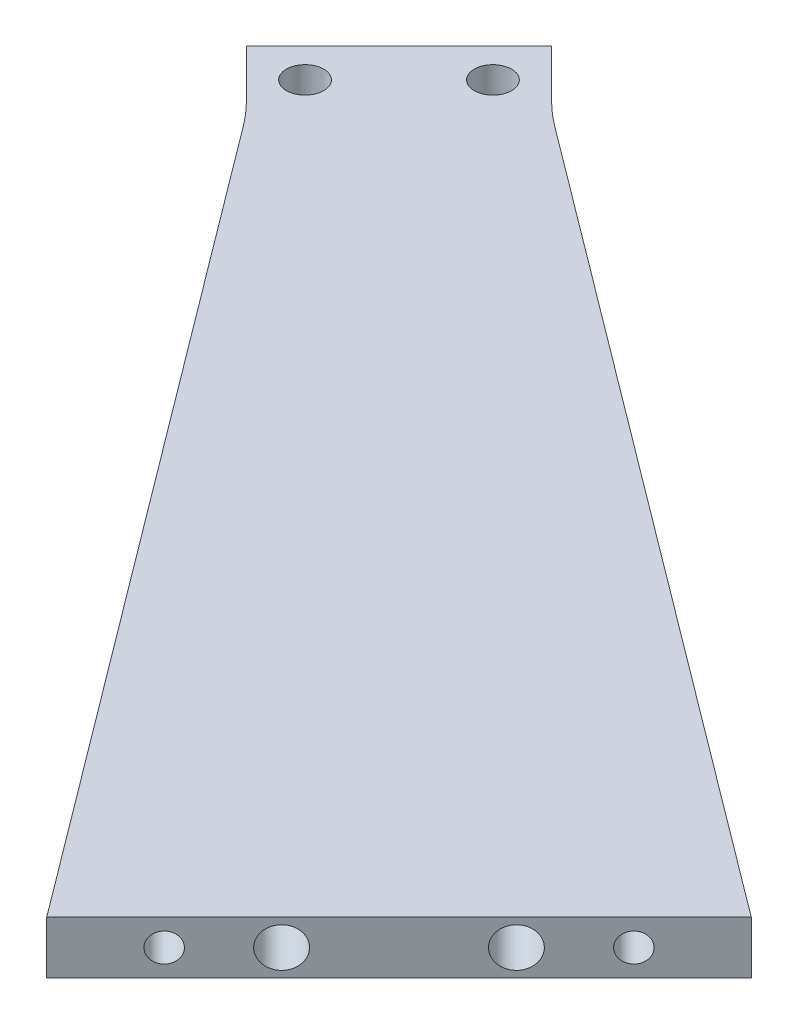
ISO-10303-21;
HEADER;
FILE_DESCRIPTION(('STEP AP214'),'2;1');
FILE_NAME('part.step','',(''),(''),'','','');
FILE_SCHEMA(('AUTOMOTIVE_DESIGN { 1 0 10303 214 1 1 1 1 }'));
ENDSEC;
DATA;
#1=APPLICATION_CONTEXT('core data for automotive mechanical design processes');
#2=APPLICATION_PROTOCOL_DEFINITION('international standard','automotive_design',2000,#1);
#3=PRODUCT_CONTEXT('',#1,'mechanical');
#4=PRODUCT('Part','Part','',(#3));
#5=PRODUCT_RELATED_PRODUCT_CATEGORY('part','',(#4));
#6=PRODUCT_DEFINITION_FORMATION('','',#4);
#7=PRODUCT_DEFINITION_CONTEXT('part definition',#1,'design');
#8=PRODUCT_DEFINITION('design','',#6,#7);
#9=PRODUCT_DEFINITION_SHAPE('','',#8);
#10=(LENGTH_UNIT() NAMED_UNIT(*) SI_UNIT(.MILLI.,.METRE.));
#11=(NAMED_UNIT(*) PLANE_ANGLE_UNIT() SI_UNIT($,.RADIAN.));
#12=(NAMED_UNIT(*) SI_UNIT($,.STERADIAN.) SOLID_ANGLE_UNIT());
#13=UNCERTAINTY_MEASURE_WITH_UNIT(LENGTH_MEASURE(1.E-05),#10,'distance_accuracy_value','');
#14=(GEOMETRIC_REPRESENTATION_CONTEXT(3) GLOBAL_UNCERTAINTY_ASSIGNED_CONTEXT((#13)) GLOBAL_UNIT_ASSIGNED_CONTEXT((#10,
#11,#12)) REPRESENTATION_CONTEXT('',''));
#15=CARTESIAN_POINT('',(0.,0.,0.));
#16=DIRECTION('',(0.,0.,1.));
#17=DIRECTION('',(1.,0.,0.));
#18=AXIS2_PLACEMENT_3D('',#15,#16,#17);
#19=CARTESIAN_POINT('',(-7.45778398625586,3.175,5.58645811516576));
#20=DIRECTION('',(-0.800354260855534,0.,0.599527361452662));
#21=DIRECTION('',(0.599527361452662,0.,0.800354260855535));
#22=AXIS2_PLACEMENT_3D('',#19,#20,#21);
#23=PLANE('',#22);
#24=DIRECTION('',(-0.599527361452662,0.,-0.800354260855534));
#25=VECTOR('',#24,1.);
#26=CARTESIAN_POINT('',(-7.45778398625586,3.175,5.58645811516576));
#27=LINE('',#26,#25);
#28=CARTESIAN_POINT('',(80.2566196646734,3.175,122.683026535866));
#29=VERTEX_POINT('',#28);
#30=CARTESIAN_POINT('',(9.55490778349449,3.175,28.2979825959658));
#31=VERTEX_POINT('',#30);
#32=EDGE_CURVE('E155',#29,#31,#27,.T.);
#33=ORIENTED_EDGE('',*,*,#32,.T.);
#34=DIRECTION('',(0.,-1.,0.));
#35=VECTOR('',#34,1.);
#36=CARTESIAN_POINT('',(9.55490778349449,-3.175,28.2979825959658));
#37=LINE('',#36,#35);
#38=CARTESIAN_POINT('',(9.55490778349449,-3.175,28.2979825959658));
#39=VERTEX_POINT('',#38);
#40=EDGE_CURVE('E205',#31,#39,#37,.T.);
#41=ORIENTED_EDGE('',*,*,#40,.T.);
#42=DIRECTION('',(-0.599527361452662,0.,-0.800354260855534));
#43=VECTOR('',#42,1.);
#44=CARTESIAN_POINT('',(-7.45778398625586,-3.175,5.58645811516576));
#45=LINE('',#44,#43);
#46=CARTESIAN_POINT('',(80.2566196646734,-3.175,122.683026535866));
#47=VERTEX_POINT('',#46);
#48=EDGE_CURVE('E177',#47,#39,#45,.T.);
#49=ORIENTED_EDGE('',*,*,#48,.F.);
#50=DIRECTION('',(0.,-1.,0.));
#51=VECTOR('',#50,1.);
#52=CARTESIAN_POINT('',(80.2566196646734,3.175,122.683026535866));
#53=LINE('',#52,#51);
#54=EDGE_CURVE('E198',#29,#47,#53,.T.);
#55=ORIENTED_EDGE('',*,*,#54,.F.);
#56=EDGE_LOOP('',(#33,#41,#49,#55));
#57=FACE_BOUND('',#56,.T.);
#58=ADVANCED_FACE('F41',(#57),#23,.T.);
#59=CARTESIAN_POINT('',(101.46982310027,3.175,101.469823100269));
#60=DIRECTION('',(-0.707106781186549,0.,-0.707106781186546));
#61=DIRECTION('',(-0.707106781186546,0.,0.707106781186549));
#62=AXIS2_PLACEMENT_3D('',#59,#60,#61);
#63=PLANE('',#62);
#64=CARTESIAN_POINT('',(94.3987552884043,0.,108.540890912135));
#65=DIRECTION('',(0.707106781186549,0.,0.707106781186546));
#66=DIRECTION('',(0.707106781186546,0.,-0.707106781186549));
#67=AXIS2_PLACEMENT_3D('',#64,#65,#66);
#68=CIRCLE('',#67,2.38125);
#69=CARTESIAN_POINT('',(96.0825533111048,0.,106.857092889434));
#70=VERTEX_POINT('',#69);
#71=EDGE_CURVE('E125',#70,#70,#68,.T.);
#72=ORIENTED_EDGE('',*,*,#71,.F.);
#73=EDGE_LOOP('',(#72));
#74=FACE_BOUND('',#73,.T.);
#75=CARTESIAN_POINT('',(108.540890912135,0.,94.3987552884038));
#76=DIRECTION('',(0.707106781186549,0.,0.707106781186546));
#77=DIRECTION('',(0.707106781186546,0.,-0.707106781186549));
#78=AXIS2_PLACEMENT_3D('',#75,#76,#77);
#79=CIRCLE('',#78,2.38125);
#80=CARTESIAN_POINT('',(110.224688934836,0.,92.7149572657033));
#81=VERTEX_POINT('',#80);
#82=EDGE_CURVE('E124',#81,#81,#79,.T.);
#83=ORIENTED_EDGE('',*,*,#82,.F.);
#84=EDGE_LOOP('',(#83));
#85=FACE_BOUND('',#84,.T.);
#86=CARTESIAN_POINT('',(115.611958724001,0.,87.3276874765383));
#87=DIRECTION('',(0.707106781186549,0.,0.707106781186546));
#88=DIRECTION('',(0.707106781186546,0.,-0.707106781186549));
#89=AXIS2_PLACEMENT_3D('',#86,#87,#88);
#90=CIRCLE('',#89,1.7272);
#91=CARTESIAN_POINT('',(116.833273556466,0.,86.1063726440729));
#92=VERTEX_POINT('',#91);
#93=EDGE_CURVE('E135',#92,#92,#90,.T.);
#94=ORIENTED_EDGE('',*,*,#93,.F.);
#95=EDGE_LOOP('',(#94));
#96=FACE_BOUND('',#95,.T.);
#97=CARTESIAN_POINT('',(87.3276874765389,0.,115.611958724));
#98=DIRECTION('',(0.707106781186549,0.,0.707106781186546));
#99=DIRECTION('',(0.707106781186546,0.,-0.707106781186549));
#100=AXIS2_PLACEMENT_3D('',#97,#98,#99);
#101=CIRCLE('',#100,1.7272);
#102=CARTESIAN_POINT('',(88.5490023090043,0.,114.390643891535));
#103=VERTEX_POINT('',#102);
#104=EDGE_CURVE('E141',#103,#103,#101,.T.);
#105=ORIENTED_EDGE('',*,*,#104,.F.);
#106=EDGE_LOOP('',(#105));
#107=FACE_BOUND('',#106,.T.);
#108=DIRECTION('',(0.707106781186546,0.,-0.707106781186549));
#109=VECTOR('',#108,1.);
#110=CARTESIAN_POINT('',(101.46982310027,-3.175,101.469823100269));
#111=LINE('',#110,#109);
#112=CARTESIAN_POINT('',(122.683026535866,-3.175,80.2566196646729));
#113=VERTEX_POINT('',#112);
#114=EDGE_CURVE('E179',#47,#113,#111,.T.);
#115=ORIENTED_EDGE('',*,*,#114,.T.);
#116=DIRECTION('',(0.,-1.,0.));
#117=VECTOR('',#116,1.);
#118=CARTESIAN_POINT('',(122.683026535866,3.175,80.2566196646729));
#119=LINE('',#118,#117);
#120=CARTESIAN_POINT('',(122.683026535866,3.175,80.2566196646729));
#121=VERTEX_POINT('',#120);
#122=EDGE_CURVE('E195',#121,#113,#119,.T.);
#123=ORIENTED_EDGE('',*,*,#122,.F.);
#124=DIRECTION('',(0.707106781186546,0.,-0.707106781186549));
#125=VECTOR('',#124,1.);
#126=CARTESIAN_POINT('',(101.46982310027,3.175,101.469823100269));
#127=LINE('',#126,#125);
#128=EDGE_CURVE('E158',#29,#121,#127,.T.);
#129=ORIENTED_EDGE('',*,*,#128,.F.);
#130=ORIENTED_EDGE('',*,*,#54,.T.);
#131=EDGE_LOOP('',(#115,#123,#129,#130));
#132=FACE_BOUND('',#131,.T.);
#133=ADVANCED_FACE('F234',(#74,#85,#96,#107,#132),#63,.F.);
#134=CARTESIAN_POINT('',(5.58645811516722,3.175,-7.45778398625763));
#135=DIRECTION('',(0.599527361452671,0.,-0.800354260855527));
#136=DIRECTION('',(-0.800354260855528,0.,-0.599527361452671));
#137=AXIS2_PLACEMENT_3D('',#134,#135,#136);
#138=PLANE('',#137);
#139=DIRECTION('',(0.800354260855528,0.,0.599527361452671));
#140=VECTOR('',#139,1.);
#141=CARTESIAN_POINT('',(5.58645811516722,-3.175,-7.45778398625763));
#142=LINE('',#141,#140);
#143=CARTESIAN_POINT('',(28.297982595967,-3.175,9.55490778349293));
#144=VERTEX_POINT('',#143);
#145=EDGE_CURVE('E182',#144,#113,#142,.T.);
#146=ORIENTED_EDGE('',*,*,#145,.F.);
#147=DIRECTION('',(0.,-1.,0.));
#148=VECTOR('',#147,1.);
#149=CARTESIAN_POINT('',(28.297982595967,3.175,9.55490778349292));
#150=LINE('',#149,#148);
#151=CARTESIAN_POINT('',(28.297982595967,3.175,9.55490778349293));
#152=VERTEX_POINT('',#151);
#153=EDGE_CURVE('E203',#144,#152,#150,.F.);
#154=ORIENTED_EDGE('',*,*,#153,.T.);
#155=DIRECTION('',(0.800354260855528,0.,0.599527361452671));
#156=VECTOR('',#155,1.);
#157=CARTESIAN_POINT('',(5.58645811516722,3.175,-7.45778398625763));
#158=LINE('',#157,#156);
#159=EDGE_CURVE('E161',#152,#121,#158,.T.);
#160=ORIENTED_EDGE('',*,*,#159,.T.);
#161=ORIENTED_EDGE('',*,*,#122,.T.);
#162=EDGE_LOOP('',(#146,#154,#160,#161));
#163=FACE_BOUND('',#162,.T.);
#164=ADVANCED_FACE('F230',(#163),#138,.T.);
#165=CARTESIAN_POINT('',(9.19238815542558,3.175,-9.19238815542575));
#166=DIRECTION('',(0.707106781186541,0.,-0.707106781186554));
#167=DIRECTION('',(-0.707106781186554,0.,-0.707106781186541));
#168=AXIS2_PLACEMENT_3D('',#165,#166,#167);
#169=PLANE('',#168);
#170=DIRECTION('',(0.707106781186554,0.,0.707106781186541));
#171=VECTOR('',#170,1.);
#172=CARTESIAN_POINT('',(9.19238815542558,3.175,-9.19238815542575));
#173=LINE('',#172,#171);
#174=CARTESIAN_POINT('',(19.7989898732241,3.175,1.41421356237256));
#175=VERTEX_POINT('',#174);
#176=CARTESIAN_POINT('',(25.6084971026202,3.175,7.22372079176859));
#177=VERTEX_POINT('',#176);
#178=EDGE_CURVE('E163',#175,#177,#173,.T.);
#179=ORIENTED_EDGE('',*,*,#178,.T.);
#180=DIRECTION('',(0.,-1.,0.));
#181=VECTOR('',#180,1.);
#182=CARTESIAN_POINT('',(25.6084971026202,-3.175,7.22372079176859));
#183=LINE('',#182,#181);
#184=CARTESIAN_POINT('',(25.6084971026202,-3.175,7.22372079176859));
#185=VERTEX_POINT('',#184);
#186=EDGE_CURVE('E200',#177,#185,#183,.T.);
#187=ORIENTED_EDGE('',*,*,#186,.T.);
#188=DIRECTION('',(0.707106781186554,0.,0.707106781186541));
#189=VECTOR('',#188,1.);
#190=CARTESIAN_POINT('',(9.19238815542558,-3.175,-9.19238815542575));
#191=LINE('',#190,#189);
#192=CARTESIAN_POINT('',(19.7989898732241,-3.175,1.41421356237256));
#193=VERTEX_POINT('',#192);
#194=EDGE_CURVE('E184',#193,#185,#191,.T.);
#195=ORIENTED_EDGE('',*,*,#194,.F.);
#196=DIRECTION('',(0.,-1.,0.));
#197=VECTOR('',#196,1.);
#198=CARTESIAN_POINT('',(19.7989898732241,3.175,1.41421356237256));
#199=LINE('',#198,#197);
#200=EDGE_CURVE('E193',#175,#193,#199,.T.);
#201=ORIENTED_EDGE('',*,*,#200,.F.);
#202=EDGE_LOOP('',(#179,#187,#195,#201));
#203=FACE_BOUND('',#202,.T.);
#204=ADVANCED_FACE('F223',(#203),#169,.T.);
#205=CARTESIAN_POINT('',(10.6066017177983,3.175,10.6066017177983));
#206=DIRECTION('',(-0.707106781186548,0.,-0.707106781186548));
#207=DIRECTION('',(-0.707106781186548,0.,0.707106781186548));
#208=AXIS2_PLACEMENT_3D('',#205,#206,#207);
#209=PLANE('',#208);
#210=DIRECTION('',(0.707106781186548,0.,-0.707106781186548));
#211=VECTOR('',#210,1.);
#212=CARTESIAN_POINT('',(10.6066017177983,-3.175,10.6066017177983));
#213=LINE('',#212,#211);
#214=CARTESIAN_POINT('',(1.41421356237391,-3.175,19.7989898732227));
#215=VERTEX_POINT('',#214);
#216=EDGE_CURVE('E187',#215,#193,#213,.T.);
#217=ORIENTED_EDGE('',*,*,#216,.F.);
#218=DIRECTION('',(0.,-1.,0.));
#219=VECTOR('',#218,1.);
#220=CARTESIAN_POINT('',(1.41421356237391,3.175,19.7989898732227));
#221=LINE('',#220,#219);
#222=CARTESIAN_POINT('',(1.41421356237391,3.175,19.7989898732227));
#223=VERTEX_POINT('',#222);
#224=EDGE_CURVE('E171',#223,#215,#221,.T.);
#225=ORIENTED_EDGE('',*,*,#224,.F.);
#226=DIRECTION('',(0.707106781186548,0.,-0.707106781186548));
#227=VECTOR('',#226,1.);
#228=CARTESIAN_POINT('',(10.6066017177983,3.175,10.6066017177983));
#229=LINE('',#228,#227);
#230=EDGE_CURVE('E166',#223,#175,#229,.T.);
#231=ORIENTED_EDGE('',*,*,#230,.T.);
#232=ORIENTED_EDGE('',*,*,#200,.T.);
#233=EDGE_LOOP('',(#217,#225,#231,#232));
#234=FACE_BOUND('',#233,.T.);
#235=ADVANCED_FACE('F244',(#234),#209,.T.);
#236=CARTESIAN_POINT('',(8.48528137423929,3.175,19.7989898732227));
#237=DIRECTION('',(0.,-1.,0.));
#238=DIRECTION('',(0.,0.,-1.));
#239=AXIS2_PLACEMENT_3D('',#236,#237,#238);
#240=CYLINDRICAL_SURFACE('',#239,2.24999999999997);
#241=CARTESIAN_POINT('',(8.48528137423929,3.175,19.7989898732227));
#242=DIRECTION('',(0.,1.,0.));
#243=DIRECTION('',(0.,0.,1.));
#244=AXIS2_PLACEMENT_3D('',#241,#242,#243);
#245=CIRCLE('',#244,2.24999999999997);
#246=CARTESIAN_POINT('',(8.48528137423929,3.175,22.0489898732226));
#247=VERTEX_POINT('',#246);
#248=EDGE_CURVE('E151',#247,#247,#245,.T.);
#249=ORIENTED_EDGE('',*,*,#248,.T.);
#250=EDGE_LOOP('',(#249));
#251=FACE_BOUND('',#250,.T.);
#252=CARTESIAN_POINT('',(8.48528137423929,-3.175,19.7989898732227));
#253=DIRECTION('',(0.,1.,0.));
#254=DIRECTION('',(0.,0.,1.));
#255=AXIS2_PLACEMENT_3D('',#252,#253,#254);
#256=CIRCLE('',#255,2.24999999999997);
#257=CARTESIAN_POINT('',(8.48528137423929,-3.175,22.0489898732226));
#258=VERTEX_POINT('',#257);
#259=EDGE_CURVE('E174',#258,#258,#256,.T.);
#260=ORIENTED_EDGE('',*,*,#259,.F.);
#261=EDGE_LOOP('',(#260));
#262=FACE_BOUND('',#261,.T.);
#263=ADVANCED_FACE('F246',(#251,#262),#240,.F.);
#264=CARTESIAN_POINT('',(19.798989873224,3.175,8.48528137423785));
#265=DIRECTION('',(0.,-1.,0.));
#266=DIRECTION('',(0.,0.,-1.));
#267=AXIS2_PLACEMENT_3D('',#264,#265,#266);
#268=CYLINDRICAL_SURFACE('',#267,2.24999999999997);
#269=CARTESIAN_POINT('',(19.798989873224,3.175,8.48528137423785));
#270=DIRECTION('',(0.,1.,0.));
#271=DIRECTION('',(0.,0.,1.));
#272=AXIS2_PLACEMENT_3D('',#269,#270,#271);
#273=CIRCLE('',#272,2.24999999999997);
#274=CARTESIAN_POINT('',(19.798989873224,3.175,10.7352813742378));
#275=VERTEX_POINT('',#274);
#276=EDGE_CURVE('E148',#275,#275,#273,.T.);
#277=ORIENTED_EDGE('',*,*,#276,.T.);
#278=EDGE_LOOP('',(#277));
#279=FACE_BOUND('',#278,.T.);
#280=CARTESIAN_POINT('',(19.798989873224,-3.175,8.48528137423785));
#281=DIRECTION('',(0.,1.,0.));
#282=DIRECTION('',(0.,0.,1.));
#283=AXIS2_PLACEMENT_3D('',#280,#281,#282);
#284=CIRCLE('',#283,2.24999999999997);
#285=CARTESIAN_POINT('',(19.798989873224,-3.175,10.7352813742378));
#286=VERTEX_POINT('',#285);
#287=EDGE_CURVE('E147',#286,#286,#284,.T.);
#288=ORIENTED_EDGE('',*,*,#287,.F.);
#289=EDGE_LOOP('',(#288));
#290=FACE_BOUND('',#289,.T.);
#291=ADVANCED_FACE('F252',(#279,#290),#268,.F.);
#292=CARTESIAN_POINT('',(-9.19238815542441,3.175,9.1923881554244));
#293=DIRECTION('',(-0.707106781186548,0.,0.707106781186547));
#294=DIRECTION('',(0.707106781186547,0.,0.707106781186548));
#295=AXIS2_PLACEMENT_3D('',#292,#293,#294);
#296=PLANE('',#295);
#297=DIRECTION('',(-0.707106781186547,0.,-0.707106781186548));
#298=VECTOR('',#297,1.);
#299=CARTESIAN_POINT('',(-9.19238815542441,-3.175,9.1923881554244));
#300=LINE('',#299,#298);
#301=CARTESIAN_POINT('',(7.22372079176982,-3.175,25.6084971026186));
#302=VERTEX_POINT('',#301);
#303=EDGE_CURVE('E152',#302,#215,#300,.T.);
#304=ORIENTED_EDGE('',*,*,#303,.F.);
#305=DIRECTION('',(0.,-1.,0.));
#306=VECTOR('',#305,1.);
#307=CARTESIAN_POINT('',(7.22372079176981,3.175,25.6084971026187));
#308=LINE('',#307,#306);
#309=CARTESIAN_POINT('',(7.22372079176982,3.175,25.6084971026186));
#310=VERTEX_POINT('',#309);
#311=EDGE_CURVE('E56',#302,#310,#308,.F.);
#312=ORIENTED_EDGE('',*,*,#311,.T.);
#313=DIRECTION('',(-0.707106781186547,0.,-0.707106781186548));
#314=VECTOR('',#313,1.);
#315=CARTESIAN_POINT('',(-9.19238815542441,3.175,9.1923881554244));
#316=LINE('',#315,#314);
#317=EDGE_CURVE('E169',#310,#223,#316,.T.);
#318=ORIENTED_EDGE('',*,*,#317,.T.);
#319=ORIENTED_EDGE('',*,*,#224,.T.);
#320=EDGE_LOOP('',(#304,#312,#318,#319));
#321=FACE_BOUND('',#320,.T.);
#322=ADVANCED_FACE('F241',(#321),#296,.T.);
#323=CARTESIAN_POINT('',(0.,3.175,0.));
#324=DIRECTION('',(0.,1.,0.));
#325=DIRECTION('',(0.,0.,1.));
#326=AXIS2_PLACEMENT_3D('',#323,#324,#325);
#327=PLANE('',#326);
#328=ORIENTED_EDGE('',*,*,#276,.F.);
#329=EDGE_LOOP('',(#328));
#330=FACE_BOUND('',#329,.T.);
#331=ORIENTED_EDGE('',*,*,#248,.F.);
#332=EDGE_LOOP('',(#331));
#333=FACE_BOUND('',#332,.T.);
#334=ORIENTED_EDGE('',*,*,#32,.F.);
#335=ORIENTED_EDGE('',*,*,#128,.T.);
#336=ORIENTED_EDGE('',*,*,#159,.F.);
#337=CARTESIAN_POINT('',(43.2861666322838,3.175,-10.4539487378953));
#338=DIRECTION('',(0.,1.,0.));
#339=DIRECTION('',(0.,0.,1.));
#340=AXIS2_PLACEMENT_3D('',#337,#338,#339);
#341=CIRCLE('',#340,25.);
#342=EDGE_CURVE('E211',#152,#177,#341,.F.);
#343=ORIENTED_EDGE('',*,*,#342,.T.);
#344=ORIENTED_EDGE('',*,*,#178,.F.);
#345=ORIENTED_EDGE('',*,*,#230,.F.);
#346=ORIENTED_EDGE('',*,*,#317,.F.);
#347=CARTESIAN_POINT('',(-10.4539487378939,3.175,43.2861666322823));
#348=DIRECTION('',(0.,1.,0.));
#349=DIRECTION('',(0.,0.,1.));
#350=AXIS2_PLACEMENT_3D('',#347,#348,#349);
#351=CIRCLE('',#350,25.);
#352=EDGE_CURVE('E11',#310,#31,#351,.F.);
#353=ORIENTED_EDGE('',*,*,#352,.T.);
#354=EDGE_LOOP('',(#334,#335,#336,#343,#344,#345,#346,#353));
#355=FACE_BOUND('',#354,.T.);
#356=ADVANCED_FACE('F217',(#330,#333,#355),#327,.T.);
#357=CARTESIAN_POINT('',(0.,-3.175,0.));
#358=DIRECTION('',(0.,1.,0.));
#359=DIRECTION('',(0.,0.,1.));
#360=AXIS2_PLACEMENT_3D('',#357,#358,#359);
#361=PLANE('',#360);
#362=ORIENTED_EDGE('',*,*,#287,.T.);
#363=EDGE_LOOP('',(#362));
#364=FACE_BOUND('',#363,.T.);
#365=ORIENTED_EDGE('',*,*,#259,.T.);
#366=EDGE_LOOP('',(#365));
#367=FACE_BOUND('',#366,.T.);
#368=ORIENTED_EDGE('',*,*,#48,.T.);
#369=CARTESIAN_POINT('',(-10.4539487378939,-3.175,43.2861666322823));
#370=DIRECTION('',(0.,1.,0.));
#371=DIRECTION('',(0.,0.,1.));
#372=AXIS2_PLACEMENT_3D('',#369,#370,#371);
#373=CIRCLE('',#372,25.);
#374=EDGE_CURVE('E49',#39,#302,#373,.T.);
#375=ORIENTED_EDGE('',*,*,#374,.T.);
#376=ORIENTED_EDGE('',*,*,#303,.T.);
#377=ORIENTED_EDGE('',*,*,#216,.T.);
#378=ORIENTED_EDGE('',*,*,#194,.T.);
#379=CARTESIAN_POINT('',(43.2861666322838,-3.175,-10.4539487378953));
#380=DIRECTION('',(0.,1.,0.));
#381=DIRECTION('',(0.,0.,1.));
#382=AXIS2_PLACEMENT_3D('',#379,#380,#381);
#383=CIRCLE('',#382,25.);
#384=EDGE_CURVE('E209',#185,#144,#383,.T.);
#385=ORIENTED_EDGE('',*,*,#384,.T.);
#386=ORIENTED_EDGE('',*,*,#145,.T.);
#387=ORIENTED_EDGE('',*,*,#114,.F.);
#388=EDGE_LOOP('',(#368,#375,#376,#377,#378,#385,#386,#387));
#389=FACE_BOUND('',#388,.T.);
#390=ADVANCED_FACE('F227',(#364,#367,#389),#361,.F.);
#391=CARTESIAN_POINT('',(79.7545738500309,0.,108.038845097492));
#392=DIRECTION('',(0.707106781186549,0.,0.707106781186546));
#393=DIRECTION('',(0.707106781186546,0.,-0.707106781186549));
#394=AXIS2_PLACEMENT_3D('',#391,#392,#393);
#395=CONICAL_SURFACE('',#394,1.7272,1.02974425867665);
#396=CARTESIAN_POINT('',(79.0207338637682,0.,107.30500511123));
#397=VERTEX_POINT('',#396);
#398=VERTEX_LOOP('',#397);
#399=FACE_BOUND('',#398,.T.);
#400=CARTESIAN_POINT('',(79.7545738500309,0.,108.038845097492));
#401=DIRECTION('',(0.707106781186549,0.,0.707106781186546));
#402=DIRECTION('',(0.707106781186546,0.,-0.707106781186549));
#403=AXIS2_PLACEMENT_3D('',#400,#401,#402);
#404=CIRCLE('',#403,1.7272);
#405=CARTESIAN_POINT('',(80.9758886824963,0.,106.817530265027));
#406=VERTEX_POINT('',#405);
#407=EDGE_CURVE('E144',#406,#406,#404,.T.);
#408=ORIENTED_EDGE('',*,*,#407,.T.);
#409=EDGE_LOOP('',(#408));
#410=FACE_BOUND('',#409,.T.);
#411=ADVANCED_FACE('F296',(#399,#410),#395,.F.);
#412=CARTESIAN_POINT('',(87.3276874765389,0.,115.611958724));
#413=DIRECTION('',(0.707106781186549,0.,0.707106781186546));
#414=DIRECTION('',(0.707106781186546,0.,-0.707106781186549));
#415=AXIS2_PLACEMENT_3D('',#412,#413,#414);
#416=CYLINDRICAL_SURFACE('',#415,1.7272);
#417=ORIENTED_EDGE('',*,*,#407,.F.);
#418=EDGE_LOOP('',(#417));
#419=FACE_BOUND('',#418,.T.);
#420=ORIENTED_EDGE('',*,*,#104,.T.);
#421=EDGE_LOOP('',(#420));
#422=FACE_BOUND('',#421,.T.);
#423=ADVANCED_FACE('F292',(#419,#422),#416,.F.);
#424=CARTESIAN_POINT('',(108.038845097493,0.,79.7545738500304));
#425=DIRECTION('',(0.707106781186549,0.,0.707106781186546));
#426=DIRECTION('',(0.707106781186546,0.,-0.707106781186549));
#427=AXIS2_PLACEMENT_3D('',#424,#425,#426);
#428=CONICAL_SURFACE('',#427,1.7272,1.02974425867665);
#429=CARTESIAN_POINT('',(107.30500511123,0.,79.0207338637677));
#430=VERTEX_POINT('',#429);
#431=VERTEX_LOOP('',#430);
#432=FACE_BOUND('',#431,.T.);
#433=CARTESIAN_POINT('',(108.038845097493,0.,79.7545738500304));
#434=DIRECTION('',(0.707106781186549,0.,0.707106781186546));
#435=DIRECTION('',(0.707106781186546,0.,-0.707106781186549));
#436=AXIS2_PLACEMENT_3D('',#433,#434,#435);
#437=CIRCLE('',#436,1.7272);
#438=CARTESIAN_POINT('',(109.260159929958,0.,78.533259017565));
#439=VERTEX_POINT('',#438);
#440=EDGE_CURVE('E138',#439,#439,#437,.T.);
#441=ORIENTED_EDGE('',*,*,#440,.T.);
#442=EDGE_LOOP('',(#441));
#443=FACE_BOUND('',#442,.T.);
#444=ADVANCED_FACE('F288',(#432,#443),#428,.F.);
#445=CARTESIAN_POINT('',(115.611958724001,0.,87.3276874765383));
#446=DIRECTION('',(0.707106781186549,0.,0.707106781186546));
#447=DIRECTION('',(0.707106781186546,0.,-0.707106781186549));
#448=AXIS2_PLACEMENT_3D('',#445,#446,#447);
#449=CYLINDRICAL_SURFACE('',#448,1.7272);
#450=ORIENTED_EDGE('',*,*,#440,.F.);
#451=EDGE_LOOP('',(#450));
#452=FACE_BOUND('',#451,.T.);
#453=ORIENTED_EDGE('',*,*,#93,.T.);
#454=EDGE_LOOP('',(#453));
#455=FACE_BOUND('',#454,.T.);
#456=ADVANCED_FACE('F284',(#452,#455),#449,.F.);
#457=CARTESIAN_POINT('',(99.4687109095118,0.,85.3265752857804));
#458=DIRECTION('',(0.707106781186549,0.,0.707106781186546));
#459=DIRECTION('',(0.707106781186546,0.,-0.707106781186549));
#460=AXIS2_PLACEMENT_3D('',#457,#458,#459);
#461=CONICAL_SURFACE('',#460,2.38125,1.02974425867666);
#462=CARTESIAN_POINT('',(98.4569829872746,0.,84.3148473635433));
#463=VERTEX_POINT('',#462);
#464=VERTEX_LOOP('',#463);
#465=FACE_BOUND('',#464,.T.);
#466=CARTESIAN_POINT('',(99.4687109095118,0.,85.3265752857804));
#467=DIRECTION('',(0.707106781186549,0.,0.707106781186546));
#468=DIRECTION('',(0.707106781186546,0.,-0.707106781186549));
#469=AXIS2_PLACEMENT_3D('',#466,#467,#468);
#470=CIRCLE('',#469,2.38125);
#471=CARTESIAN_POINT('',(101.152508932212,0.,83.64277726308));
#472=VERTEX_POINT('',#471);
#473=EDGE_CURVE('E128',#472,#472,#470,.T.);
#474=ORIENTED_EDGE('',*,*,#473,.T.);
#475=EDGE_LOOP('',(#474));
#476=FACE_BOUND('',#475,.T.);
#477=ADVANCED_FACE('F280',(#465,#476),#461,.F.);
#478=CARTESIAN_POINT('',(108.540890912135,0.,94.3987552884038));
#479=DIRECTION('',(0.707106781186549,0.,0.707106781186546));
#480=DIRECTION('',(0.707106781186546,0.,-0.707106781186549));
#481=AXIS2_PLACEMENT_3D('',#478,#479,#480);
#482=CYLINDRICAL_SURFACE('',#481,2.38125);
#483=ORIENTED_EDGE('',*,*,#473,.F.);
#484=EDGE_LOOP('',(#483));
#485=FACE_BOUND('',#484,.T.);
#486=ORIENTED_EDGE('',*,*,#82,.T.);
#487=EDGE_LOOP('',(#486));
#488=FACE_BOUND('',#487,.T.);
#489=ADVANCED_FACE('F118',(#485,#488),#482,.F.);
#490=CARTESIAN_POINT('',(85.3265752857809,0.,99.4687109095114));
#491=DIRECTION('',(0.707106781186549,0.,0.707106781186546));
#492=DIRECTION('',(0.707106781186546,0.,-0.707106781186549));
#493=AXIS2_PLACEMENT_3D('',#490,#491,#492);
#494=CONICAL_SURFACE('',#493,2.38125,1.02974425867666);
#495=CARTESIAN_POINT('',(84.3148473635437,0.,98.4569829872743));
#496=VERTEX_POINT('',#495);
#497=VERTEX_LOOP('',#496);
#498=FACE_BOUND('',#497,.T.);
#499=CARTESIAN_POINT('',(85.3265752857809,0.,99.4687109095114));
#500=DIRECTION('',(0.707106781186549,0.,0.707106781186546));
#501=DIRECTION('',(0.707106781186546,0.,-0.707106781186549));
#502=AXIS2_PLACEMENT_3D('',#499,#500,#501);
#503=CIRCLE('',#502,2.38125);
#504=CARTESIAN_POINT('',(87.0103733084813,0.,97.784912886811));
#505=VERTEX_POINT('',#504);
#506=EDGE_CURVE('E122',#505,#505,#503,.T.);
#507=ORIENTED_EDGE('',*,*,#506,.T.);
#508=EDGE_LOOP('',(#507));
#509=FACE_BOUND('',#508,.T.);
#510=ADVANCED_FACE('F114',(#498,#509),#494,.F.);
#511=CARTESIAN_POINT('',(94.3987552884043,0.,108.540890912135));
#512=DIRECTION('',(0.707106781186549,0.,0.707106781186546));
#513=DIRECTION('',(0.707106781186546,0.,-0.707106781186549));
#514=AXIS2_PLACEMENT_3D('',#511,#512,#513);
#515=CYLINDRICAL_SURFACE('',#514,2.38125);
#516=ORIENTED_EDGE('',*,*,#506,.F.);
#517=EDGE_LOOP('',(#516));
#518=FACE_BOUND('',#517,.T.);
#519=ORIENTED_EDGE('',*,*,#71,.T.);
#520=EDGE_LOOP('',(#519));
#521=FACE_BOUND('',#520,.T.);
#522=ADVANCED_FACE('F117',(#518,#521),#515,.F.);
#523=CARTESIAN_POINT('',(43.2861666322838,3.175,-10.4539487378953));
#524=DIRECTION('',(0.,1.,0.));
#525=DIRECTION('',(0.,0.,1.));
#526=AXIS2_PLACEMENT_3D('',#523,#524,#525);
#527=CYLINDRICAL_SURFACE('',#526,25.);
#528=ORIENTED_EDGE('',*,*,#342,.F.);
#529=ORIENTED_EDGE('',*,*,#153,.F.);
#530=ORIENTED_EDGE('',*,*,#384,.F.);
#531=ORIENTED_EDGE('',*,*,#186,.F.);
#532=EDGE_LOOP('',(#528,#529,#530,#531));
#533=FACE_BOUND('',#532,.T.);
#534=ADVANCED_FACE('F225',(#533),#527,.F.);
#535=CARTESIAN_POINT('',(-10.4539487378939,3.175,43.2861666322823));
#536=DIRECTION('',(0.,1.,0.));
#537=DIRECTION('',(0.,0.,1.));
#538=AXIS2_PLACEMENT_3D('',#535,#536,#537);
#539=CYLINDRICAL_SURFACE('',#538,25.);
#540=ORIENTED_EDGE('',*,*,#352,.F.);
#541=ORIENTED_EDGE('',*,*,#311,.F.);
#542=ORIENTED_EDGE('',*,*,#374,.F.);
#543=ORIENTED_EDGE('',*,*,#40,.F.);
#544=EDGE_LOOP('',(#540,#541,#542,#543));
#545=FACE_BOUND('',#544,.T.);
#546=ADVANCED_FACE('F43',(#545),#539,.F.);
#547=CLOSED_SHELL('',(#58,#133,#164,#204,#235,#263,#291,#322,#356,#390,#411,#423,#444,#456,#477,
#489,#510,#522,#534,#546));
#548=MANIFOLD_SOLID_BREP('B2',#547);
#549=ADVANCED_BREP_SHAPE_REPRESENTATION('',(#18,#548),#14);
#550=SHAPE_DEFINITION_REPRESENTATION(#9,#549);
ENDSEC;
END-ISO-10303-21;
